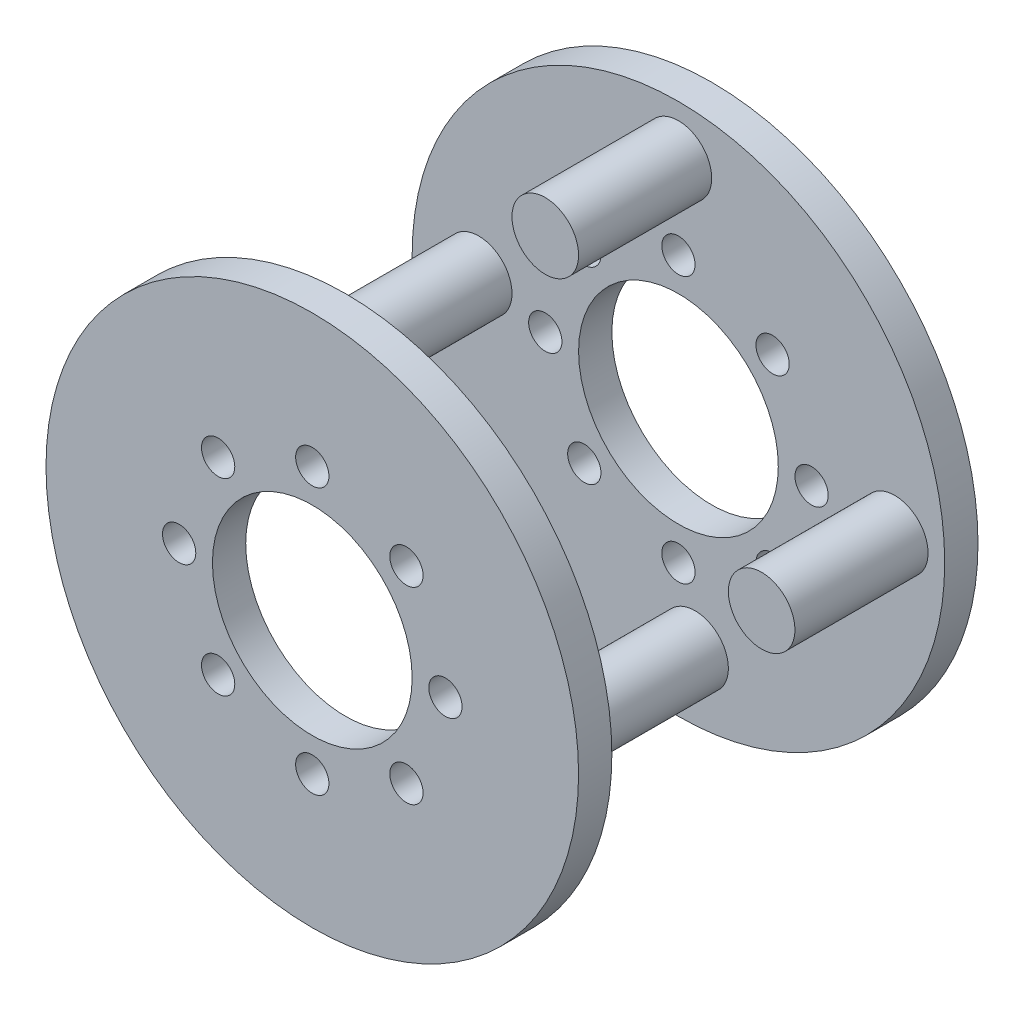
ISO-10303-21;
HEADER;
FILE_DESCRIPTION(('STEP AP214'),'2;1');
FILE_NAME('part.step','',(''),(''),'','','');
FILE_SCHEMA(('AUTOMOTIVE_DESIGN { 1 0 10303 214 1 1 1 1 }'));
ENDSEC;
DATA;
#1=APPLICATION_CONTEXT('core data for automotive mechanical design processes');
#2=APPLICATION_PROTOCOL_DEFINITION('international standard','automotive_design',2000,#1);
#3=PRODUCT_CONTEXT('',#1,'mechanical');
#4=PRODUCT('Part','Part','',(#3));
#5=PRODUCT_RELATED_PRODUCT_CATEGORY('part','',(#4));
#6=PRODUCT_DEFINITION_FORMATION('','',#4);
#7=PRODUCT_DEFINITION_CONTEXT('part definition',#1,'design');
#8=PRODUCT_DEFINITION('design','',#6,#7);
#9=PRODUCT_DEFINITION_SHAPE('','',#8);
#10=(LENGTH_UNIT() NAMED_UNIT(*) SI_UNIT(.MILLI.,.METRE.));
#11=(NAMED_UNIT(*) PLANE_ANGLE_UNIT() SI_UNIT($,.RADIAN.));
#12=(NAMED_UNIT(*) SI_UNIT($,.STERADIAN.) SOLID_ANGLE_UNIT());
#13=UNCERTAINTY_MEASURE_WITH_UNIT(LENGTH_MEASURE(1.E-05),#10,'distance_accuracy_value','');
#14=(GEOMETRIC_REPRESENTATION_CONTEXT(3) GLOBAL_UNCERTAINTY_ASSIGNED_CONTEXT((#13)) GLOBAL_UNIT_ASSIGNED_CONTEXT((#10,
#11,#12)) REPRESENTATION_CONTEXT('',''));
#15=CARTESIAN_POINT('',(0.,0.,0.));
#16=DIRECTION('',(0.,0.,1.));
#17=DIRECTION('',(1.,0.,0.));
#18=AXIS2_PLACEMENT_3D('',#15,#16,#17);
#19=CARTESIAN_POINT('',(-2.79318507107451E-13,0.,60.));
#20=DIRECTION('',(0.,0.,-1.));
#21=DIRECTION('',(1.,0.,0.));
#22=AXIS2_PLACEMENT_3D('',#19,#20,#21);
#23=CYLINDRICAL_SURFACE('',#22,80.);
#24=CARTESIAN_POINT('',(-2.79318507107451E-13,0.,60.));
#25=DIRECTION('',(0.,0.,-1.));
#26=DIRECTION('',(-1.,0.,0.));
#27=AXIS2_PLACEMENT_3D('',#24,#25,#26);
#28=CIRCLE('',#27,80.);
#29=CARTESIAN_POINT('',(-80.0000000000003,0.,59.9999999999994));
#30=VERTEX_POINT('',#29);
#31=EDGE_CURVE('E68',#30,#30,#28,.T.);
#32=ORIENTED_EDGE('',*,*,#31,.T.);
#33=EDGE_LOOP('',(#32));
#34=FACE_BOUND('',#33,.T.);
#35=CARTESIAN_POINT('',(-2.09488880330588E-13,0.,50.));
#36=DIRECTION('',(0.,0.,-1.));
#37=DIRECTION('',(-1.,0.,0.));
#38=AXIS2_PLACEMENT_3D('',#35,#36,#37);
#39=CIRCLE('',#38,80.);
#40=CARTESIAN_POINT('',(-80.0000000000002,0.,49.9999999999994));
#41=VERTEX_POINT('',#40);
#42=EDGE_CURVE('E69',#41,#41,#39,.T.);
#43=ORIENTED_EDGE('',*,*,#42,.F.);
#44=EDGE_LOOP('',(#43));
#45=FACE_BOUND('',#44,.T.);
#46=ADVANCED_FACE('F45',(#34,#45),#23,.T.);
#47=CARTESIAN_POINT('',(-2.79318507107451E-13,0.,60.));
#48=DIRECTION('',(0.,0.,1.));
#49=DIRECTION('',(-1.,0.,0.));
#50=AXIS2_PLACEMENT_3D('',#47,#48,#49);
#51=PLANE('',#50);
#52=CARTESIAN_POINT('',(39.9999999999996,-4.18977760661176E-13,60.0000000000003));
#53=DIRECTION('',(0.,0.,1.));
#54=DIRECTION('',(0.,-1.,0.));
#55=AXIS2_PLACEMENT_3D('',#52,#53,#54);
#56=CIRCLE('',#55,5.);
#57=CARTESIAN_POINT('',(39.9999999999996,-5.00000000000042,60.0000000000002));
#58=VERTEX_POINT('',#57);
#59=EDGE_CURVE('E97',#58,#58,#56,.T.);
#60=ORIENTED_EDGE('',*,*,#59,.F.);
#61=EDGE_LOOP('',(#60));
#62=FACE_BOUND('',#61,.T.);
#63=CARTESIAN_POINT('',(28.2842712474611,-28.2842712474622,60.0000000000002));
#64=DIRECTION('',(0.,0.,1.));
#65=DIRECTION('',(-0.707106781186551,-0.707106781186544,0.));
#66=AXIS2_PLACEMENT_3D('',#63,#64,#65);
#67=CIRCLE('',#66,5.);
#68=CARTESIAN_POINT('',(24.7487373415284,-31.819805153395,60.0000000000001));
#69=VERTEX_POINT('',#68);
#70=EDGE_CURVE('E122',#69,#69,#67,.T.);
#71=ORIENTED_EDGE('',*,*,#70,.F.);
#72=EDGE_LOOP('',(#71));
#73=FACE_BOUND('',#72,.T.);
#74=CARTESIAN_POINT('',(-6.98296267768627E-13,-40.,60.));
#75=DIRECTION('',(0.,0.,1.));
#76=DIRECTION('',(-1.,0.,0.));
#77=AXIS2_PLACEMENT_3D('',#74,#75,#76);
#78=CIRCLE('',#77,5.);
#79=CARTESIAN_POINT('',(-5.0000000000007,-40.,59.9999999999999));
#80=VERTEX_POINT('',#79);
#81=EDGE_CURVE('E114',#80,#80,#78,.T.);
#82=ORIENTED_EDGE('',*,*,#81,.F.);
#83=EDGE_LOOP('',(#82));
#84=FACE_BOUND('',#83,.T.);
#85=CARTESIAN_POINT('',(-28.2842712474628,-28.2842712474615,59.9999999999998));
#86=DIRECTION('',(0.,0.,1.));
#87=DIRECTION('',(-0.707106781186541,0.707106781186554,0.));
#88=AXIS2_PLACEMENT_3D('',#85,#86,#87);
#89=CIRCLE('',#88,5.);
#90=CARTESIAN_POINT('',(-31.8198051533955,-24.7487373415287,59.9999999999998));
#91=VERTEX_POINT('',#90);
#92=EDGE_CURVE('E105',#91,#91,#89,.T.);
#93=ORIENTED_EDGE('',*,*,#92,.F.);
#94=EDGE_LOOP('',(#93));
#95=FACE_BOUND('',#94,.T.);
#96=CARTESIAN_POINT('',(-40.0000000000004,6.98296267768627E-13,59.9999999999997));
#97=DIRECTION('',(0.,0.,1.));
#98=DIRECTION('',(0.,1.,0.));
#99=AXIS2_PLACEMENT_3D('',#96,#97,#98);
#100=CIRCLE('',#99,5.);
#101=CARTESIAN_POINT('',(-40.0000000000004,5.0000000000007,59.9999999999997));
#102=VERTEX_POINT('',#101);
#103=EDGE_CURVE('E106',#102,#102,#100,.T.);
#104=ORIENTED_EDGE('',*,*,#103,.F.);
#105=EDGE_LOOP('',(#104));
#106=FACE_BOUND('',#105,.T.);
#107=CARTESIAN_POINT('',(-28.2842712474618,28.2842712474624,59.9999999999998));
#108=DIRECTION('',(0.,0.,1.));
#109=DIRECTION('',(0.707106781186556,0.707106781186539,0.));
#110=AXIS2_PLACEMENT_3D('',#107,#108,#109);
#111=CIRCLE('',#110,5.);
#112=CARTESIAN_POINT('',(-24.748737341529,31.8198051533951,59.9999999999998));
#113=VERTEX_POINT('',#112);
#114=EDGE_CURVE('E137',#113,#113,#111,.T.);
#115=ORIENTED_EDGE('',*,*,#114,.F.);
#116=EDGE_LOOP('',(#115));
#117=FACE_BOUND('',#116,.T.);
#118=CARTESIAN_POINT('',(28.2842712474617,28.2842712474617,60.0000000000002));
#119=DIRECTION('',(0.,0.,1.));
#120=DIRECTION('',(0.707106781186546,-0.707106781186549,0.));
#121=AXIS2_PLACEMENT_3D('',#118,#119,#120);
#122=CIRCLE('',#121,5.);
#123=CARTESIAN_POINT('',(31.8198051533945,24.7487373415289,60.0000000000002));
#124=VERTEX_POINT('',#123);
#125=EDGE_CURVE('E89',#124,#124,#122,.T.);
#126=ORIENTED_EDGE('',*,*,#125,.F.);
#127=EDGE_LOOP('',(#126));
#128=FACE_BOUND('',#127,.T.);
#129=CARTESIAN_POINT('',(-1.39659253553725E-13,40.,60.));
#130=DIRECTION('',(0.,0.,1.));
#131=DIRECTION('',(1.,0.,0.));
#132=AXIS2_PLACEMENT_3D('',#129,#130,#131);
#133=CIRCLE('',#132,5.);
#134=CARTESIAN_POINT('',(4.99999999999986,40.,60.));
#135=VERTEX_POINT('',#134);
#136=EDGE_CURVE('E81',#135,#135,#133,.T.);
#137=ORIENTED_EDGE('',*,*,#136,.F.);
#138=EDGE_LOOP('',(#137));
#139=FACE_BOUND('',#138,.T.);
#140=CARTESIAN_POINT('',(-1.39659253553725E-13,0.,60.));
#141=DIRECTION('',(0.,0.,1.));
#142=DIRECTION('',(1.,0.,0.));
#143=AXIS2_PLACEMENT_3D('',#140,#141,#142);
#144=CIRCLE('',#143,30.);
#145=CARTESIAN_POINT('',(29.9999999999999,0.,60.));
#146=VERTEX_POINT('',#145);
#147=EDGE_CURVE('E73',#146,#146,#144,.T.);
#148=ORIENTED_EDGE('',*,*,#147,.F.);
#149=EDGE_LOOP('',(#148));
#150=FACE_BOUND('',#149,.T.);
#151=ORIENTED_EDGE('',*,*,#31,.F.);
#152=EDGE_LOOP('',(#151));
#153=FACE_BOUND('',#152,.T.);
#154=ADVANCED_FACE('F177',(#62,#73,#84,#95,#106,#117,#128,#139,#150,#153),#51,.T.);
#155=CARTESIAN_POINT('',(-2.09488880330588E-13,0.,50.));
#156=DIRECTION('',(0.,0.,1.));
#157=DIRECTION('',(-1.,0.,0.));
#158=AXIS2_PLACEMENT_3D('',#155,#156,#157);
#159=PLANE('',#158);
#160=CARTESIAN_POINT('',(-65.0000000000004,8.90306508011411E-13,49.9999999999996));
#161=DIRECTION('',(0.,0.,-1.));
#162=DIRECTION('',(-1.,0.,0.));
#163=AXIS2_PLACEMENT_3D('',#160,#161,#162);
#164=CIRCLE('',#163,10.);
#165=CARTESIAN_POINT('',(-75.0000000000003,8.90306508011411E-13,49.9999999999995));
#166=VERTEX_POINT('',#165);
#167=EDGE_CURVE('E11',#166,#166,#164,.F.);
#168=ORIENTED_EDGE('',*,*,#167,.T.);
#169=EDGE_LOOP('',(#168));
#170=FACE_BOUND('',#169,.T.);
#171=CARTESIAN_POINT('',(-5.58615780821314E-13,-65.,50.));
#172=DIRECTION('',(0.,0.,-1.));
#173=DIRECTION('',(-1.,0.,0.));
#174=AXIS2_PLACEMENT_3D('',#171,#172,#173);
#175=CIRCLE('',#174,10.);
#176=CARTESIAN_POINT('',(-10.0000000000006,-65.,49.9999999999999));
#177=VERTEX_POINT('',#176);
#178=EDGE_CURVE('E52',#177,#177,#175,.F.);
#179=ORIENTED_EDGE('',*,*,#178,.T.);
#180=EDGE_LOOP('',(#179));
#181=FACE_BOUND('',#180,.T.);
#182=CARTESIAN_POINT('',(64.9999999999997,-4.36413933961804E-13,50.0000000000005));
#183=DIRECTION('',(0.,0.,-1.));
#184=DIRECTION('',(-1.,0.,0.));
#185=AXIS2_PLACEMENT_3D('',#182,#183,#184);
#186=CIRCLE('',#185,10.);
#187=CARTESIAN_POINT('',(54.9999999999997,-4.36413933961804E-13,50.0000000000004));
#188=VERTEX_POINT('',#187);
#189=EDGE_CURVE('E57',#188,#188,#186,.F.);
#190=ORIENTED_EDGE('',*,*,#189,.T.);
#191=EDGE_LOOP('',(#190));
#192=FACE_BOUND('',#191,.T.);
#193=CARTESIAN_POINT('',(-1.39680486947313E-13,65.,50.));
#194=DIRECTION('',(0.,0.,-1.));
#195=DIRECTION('',(-1.,0.,0.));
#196=AXIS2_PLACEMENT_3D('',#193,#194,#195);
#197=CIRCLE('',#196,10.);
#198=CARTESIAN_POINT('',(-10.0000000000001,65.,49.9999999999999));
#199=VERTEX_POINT('',#198);
#200=EDGE_CURVE('E62',#199,#199,#197,.F.);
#201=ORIENTED_EDGE('',*,*,#200,.T.);
#202=EDGE_LOOP('',(#201));
#203=FACE_BOUND('',#202,.T.);
#204=CARTESIAN_POINT('',(39.9999999999997,-3.49148133884313E-13,50.0000000000003));
#205=DIRECTION('',(0.,0.,1.));
#206=DIRECTION('',(0.,-1.,0.));
#207=AXIS2_PLACEMENT_3D('',#204,#205,#206);
#208=CIRCLE('',#207,5.);
#209=CARTESIAN_POINT('',(39.9999999999996,-5.00000000000035,50.0000000000002));
#210=VERTEX_POINT('',#209);
#211=EDGE_CURVE('E126',#210,#210,#208,.T.);
#212=ORIENTED_EDGE('',*,*,#211,.T.);
#213=EDGE_LOOP('',(#212));
#214=FACE_BOUND('',#213,.T.);
#215=CARTESIAN_POINT('',(28.2842712474613,-28.2842712474622,50.0000000000002));
#216=DIRECTION('',(0.,0.,1.));
#217=DIRECTION('',(-0.707106781186551,-0.707106781186544,0.));
#218=AXIS2_PLACEMENT_3D('',#215,#216,#217);
#219=CIRCLE('',#218,5.);
#220=CARTESIAN_POINT('',(24.7487373415285,-31.8198051533949,50.0000000000001));
#221=VERTEX_POINT('',#220);
#222=EDGE_CURVE('E118',#221,#221,#219,.T.);
#223=ORIENTED_EDGE('',*,*,#222,.T.);
#224=EDGE_LOOP('',(#223));
#225=FACE_BOUND('',#224,.T.);
#226=CARTESIAN_POINT('',(-5.58637014214901E-13,-40.,50.));
#227=DIRECTION('',(0.,0.,1.));
#228=DIRECTION('',(-1.,0.,0.));
#229=AXIS2_PLACEMENT_3D('',#226,#227,#228);
#230=CIRCLE('',#229,5.);
#231=CARTESIAN_POINT('',(-5.00000000000056,-40.,49.9999999999999));
#232=VERTEX_POINT('',#231);
#233=EDGE_CURVE('E110',#232,#232,#230,.T.);
#234=ORIENTED_EDGE('',*,*,#233,.T.);
#235=EDGE_LOOP('',(#234));
#236=FACE_BOUND('',#235,.T.);
#237=CARTESIAN_POINT('',(-28.2842712474626,-28.2842712474615,49.9999999999998));
#238=DIRECTION('',(0.,0.,1.));
#239=DIRECTION('',(-0.707106781186541,0.707106781186554,0.));
#240=AXIS2_PLACEMENT_3D('',#237,#238,#239);
#241=CIRCLE('',#240,5.);
#242=CARTESIAN_POINT('',(-31.8198051533954,-24.7487373415287,49.9999999999997));
#243=VERTEX_POINT('',#242);
#244=EDGE_CURVE('E101',#243,#243,#241,.T.);
#245=ORIENTED_EDGE('',*,*,#244,.T.);
#246=EDGE_LOOP('',(#245));
#247=FACE_BOUND('',#246,.T.);
#248=CARTESIAN_POINT('',(-40.0000000000003,6.28466640991764E-13,49.9999999999997));
#249=DIRECTION('',(0.,0.,1.));
#250=DIRECTION('',(0.,1.,0.));
#251=AXIS2_PLACEMENT_3D('',#248,#249,#250);
#252=CIRCLE('',#251,5.);
#253=CARTESIAN_POINT('',(-40.0000000000003,5.00000000000063,49.9999999999997));
#254=VERTEX_POINT('',#253);
#255=EDGE_CURVE('E142',#254,#254,#252,.T.);
#256=ORIENTED_EDGE('',*,*,#255,.T.);
#257=EDGE_LOOP('',(#256));
#258=FACE_BOUND('',#257,.T.);
#259=CARTESIAN_POINT('',(-28.2842712474618,28.2842712474624,49.9999999999998));
#260=DIRECTION('',(0.,0.,1.));
#261=DIRECTION('',(0.707106781186556,0.707106781186539,0.));
#262=AXIS2_PLACEMENT_3D('',#259,#260,#261);
#263=CIRCLE('',#262,5.);
#264=CARTESIAN_POINT('',(-24.748737341529,31.8198051533951,49.9999999999998));
#265=VERTEX_POINT('',#264);
#266=EDGE_CURVE('E133',#265,#265,#263,.T.);
#267=ORIENTED_EDGE('',*,*,#266,.T.);
#268=EDGE_LOOP('',(#267));
#269=FACE_BOUND('',#268,.T.);
#270=CARTESIAN_POINT('',(28.2842712474618,28.2842712474617,50.0000000000002));
#271=DIRECTION('',(0.,0.,1.));
#272=DIRECTION('',(0.707106781186546,-0.707106781186549,0.));
#273=AXIS2_PLACEMENT_3D('',#270,#271,#272);
#274=CIRCLE('',#273,5.);
#275=CARTESIAN_POINT('',(31.8198051533945,24.748737341529,50.0000000000002));
#276=VERTEX_POINT('',#275);
#277=EDGE_CURVE('E93',#276,#276,#274,.T.);
#278=ORIENTED_EDGE('',*,*,#277,.T.);
#279=EDGE_LOOP('',(#278));
#280=FACE_BOUND('',#279,.T.);
#281=CARTESIAN_POINT('',(-1.39659253553725E-13,40.,50.));
#282=DIRECTION('',(0.,0.,1.));
#283=DIRECTION('',(1.,0.,0.));
#284=AXIS2_PLACEMENT_3D('',#281,#282,#283);
#285=CIRCLE('',#284,5.);
#286=CARTESIAN_POINT('',(4.99999999999986,40.,50.));
#287=VERTEX_POINT('',#286);
#288=EDGE_CURVE('E85',#287,#287,#285,.T.);
#289=ORIENTED_EDGE('',*,*,#288,.T.);
#290=EDGE_LOOP('',(#289));
#291=FACE_BOUND('',#290,.T.);
#292=CARTESIAN_POINT('',(-1.39659253553725E-13,0.,50.));
#293=DIRECTION('',(0.,0.,1.));
#294=DIRECTION('',(1.,0.,0.));
#295=AXIS2_PLACEMENT_3D('',#292,#293,#294);
#296=CIRCLE('',#295,30.);
#297=CARTESIAN_POINT('',(29.9999999999999,0.,50.));
#298=VERTEX_POINT('',#297);
#299=EDGE_CURVE('E77',#298,#298,#296,.T.);
#300=ORIENTED_EDGE('',*,*,#299,.T.);
#301=EDGE_LOOP('',(#300));
#302=FACE_BOUND('',#301,.T.);
#303=ORIENTED_EDGE('',*,*,#42,.T.);
#304=EDGE_LOOP('',(#303));
#305=FACE_BOUND('',#304,.T.);
#306=ADVANCED_FACE('F182',(#170,#181,#192,#203,#214,#225,#236,#247,#258,#269,#280,#291,#302,
#305),#159,.F.);
#307=CARTESIAN_POINT('',(-1.39659253553725E-13,0.,60.));
#308=DIRECTION('',(0.,0.,-1.));
#309=DIRECTION('',(1.,0.,0.));
#310=AXIS2_PLACEMENT_3D('',#307,#308,#309);
#311=CYLINDRICAL_SURFACE('',#310,30.);
#312=ORIENTED_EDGE('',*,*,#147,.T.);
#313=EDGE_LOOP('',(#312));
#314=FACE_BOUND('',#313,.T.);
#315=ORIENTED_EDGE('',*,*,#299,.F.);
#316=EDGE_LOOP('',(#315));
#317=FACE_BOUND('',#316,.T.);
#318=ADVANCED_FACE('F190',(#314,#317),#311,.F.);
#319=CARTESIAN_POINT('',(-1.39659253553725E-13,40.,60.));
#320=DIRECTION('',(0.,0.,-1.));
#321=DIRECTION('',(1.,0.,0.));
#322=AXIS2_PLACEMENT_3D('',#319,#320,#321);
#323=CYLINDRICAL_SURFACE('',#322,5.);
#324=ORIENTED_EDGE('',*,*,#136,.T.);
#325=EDGE_LOOP('',(#324));
#326=FACE_BOUND('',#325,.T.);
#327=ORIENTED_EDGE('',*,*,#288,.F.);
#328=EDGE_LOOP('',(#327));
#329=FACE_BOUND('',#328,.T.);
#330=ADVANCED_FACE('F194',(#326,#329),#323,.F.);
#331=CARTESIAN_POINT('',(28.2842712474617,28.2842712474617,60.0000000000002));
#332=DIRECTION('',(0.,0.,-1.));
#333=DIRECTION('',(0.,-1.,0.));
#334=AXIS2_PLACEMENT_3D('',#331,#332,#333);
#335=CYLINDRICAL_SURFACE('',#334,5.);
#336=ORIENTED_EDGE('',*,*,#125,.T.);
#337=EDGE_LOOP('',(#336));
#338=FACE_BOUND('',#337,.T.);
#339=ORIENTED_EDGE('',*,*,#277,.F.);
#340=EDGE_LOOP('',(#339));
#341=FACE_BOUND('',#340,.T.);
#342=ADVANCED_FACE('F200',(#338,#341),#335,.F.);
#343=CARTESIAN_POINT('',(-28.2842712474618,28.2842712474624,59.9999999999998));
#344=DIRECTION('',(0.,0.,-1.));
#345=DIRECTION('',(0.,-1.,0.));
#346=AXIS2_PLACEMENT_3D('',#343,#344,#345);
#347=CYLINDRICAL_SURFACE('',#346,5.);
#348=ORIENTED_EDGE('',*,*,#114,.T.);
#349=EDGE_LOOP('',(#348));
#350=FACE_BOUND('',#349,.T.);
#351=ORIENTED_EDGE('',*,*,#266,.F.);
#352=EDGE_LOOP('',(#351));
#353=FACE_BOUND('',#352,.T.);
#354=ADVANCED_FACE('F204',(#350,#353),#347,.F.);
#355=CARTESIAN_POINT('',(-40.0000000000004,6.98296267768627E-13,59.9999999999997));
#356=DIRECTION('',(0.,0.,-1.));
#357=DIRECTION('',(0.,-1.,0.));
#358=AXIS2_PLACEMENT_3D('',#355,#356,#357);
#359=CYLINDRICAL_SURFACE('',#358,5.);
#360=ORIENTED_EDGE('',*,*,#103,.T.);
#361=EDGE_LOOP('',(#360));
#362=FACE_BOUND('',#361,.T.);
#363=ORIENTED_EDGE('',*,*,#255,.F.);
#364=EDGE_LOOP('',(#363));
#365=FACE_BOUND('',#364,.T.);
#366=ADVANCED_FACE('F210',(#362,#365),#359,.F.);
#367=CARTESIAN_POINT('',(-28.2842712474628,-28.2842712474615,59.9999999999998));
#368=DIRECTION('',(0.,0.,-1.));
#369=DIRECTION('',(1.,0.,0.));
#370=AXIS2_PLACEMENT_3D('',#367,#368,#369);
#371=CYLINDRICAL_SURFACE('',#370,5.);
#372=ORIENTED_EDGE('',*,*,#92,.T.);
#373=EDGE_LOOP('',(#372));
#374=FACE_BOUND('',#373,.T.);
#375=ORIENTED_EDGE('',*,*,#244,.F.);
#376=EDGE_LOOP('',(#375));
#377=FACE_BOUND('',#376,.T.);
#378=ADVANCED_FACE('F206',(#374,#377),#371,.F.);
#379=CARTESIAN_POINT('',(-6.98296267768627E-13,-40.,60.));
#380=DIRECTION('',(0.,0.,-1.));
#381=DIRECTION('',(1.,0.,0.));
#382=AXIS2_PLACEMENT_3D('',#379,#380,#381);
#383=CYLINDRICAL_SURFACE('',#382,5.);
#384=ORIENTED_EDGE('',*,*,#81,.T.);
#385=EDGE_LOOP('',(#384));
#386=FACE_BOUND('',#385,.T.);
#387=ORIENTED_EDGE('',*,*,#233,.F.);
#388=EDGE_LOOP('',(#387));
#389=FACE_BOUND('',#388,.T.);
#390=ADVANCED_FACE('F209',(#386,#389),#383,.F.);
#391=CARTESIAN_POINT('',(28.2842712474611,-28.2842712474622,60.0000000000002));
#392=DIRECTION('',(0.,0.,-1.));
#393=DIRECTION('',(1.,0.,0.));
#394=AXIS2_PLACEMENT_3D('',#391,#392,#393);
#395=CYLINDRICAL_SURFACE('',#394,5.);
#396=ORIENTED_EDGE('',*,*,#70,.T.);
#397=EDGE_LOOP('',(#396));
#398=FACE_BOUND('',#397,.T.);
#399=ORIENTED_EDGE('',*,*,#222,.F.);
#400=EDGE_LOOP('',(#399));
#401=FACE_BOUND('',#400,.T.);
#402=ADVANCED_FACE('F214',(#398,#401),#395,.F.);
#403=CARTESIAN_POINT('',(39.9999999999996,-4.18977760661176E-13,60.0000000000003));
#404=DIRECTION('',(0.,0.,-1.));
#405=DIRECTION('',(1.,0.,0.));
#406=AXIS2_PLACEMENT_3D('',#403,#404,#405);
#407=CYLINDRICAL_SURFACE('',#406,5.);
#408=ORIENTED_EDGE('',*,*,#59,.T.);
#409=EDGE_LOOP('',(#408));
#410=FACE_BOUND('',#409,.T.);
#411=ORIENTED_EDGE('',*,*,#211,.F.);
#412=EDGE_LOOP('',(#411));
#413=FACE_BOUND('',#412,.T.);
#414=ADVANCED_FACE('F218',(#410,#413),#407,.F.);
#415=CARTESIAN_POINT('',(-1.39680486947313E-13,65.,10.));
#416=DIRECTION('',(0.,0.,1.));
#417=DIRECTION('',(-1.,0.,0.));
#418=AXIS2_PLACEMENT_3D('',#415,#416,#417);
#419=CYLINDRICAL_SURFACE('',#418,10.);
#420=CARTESIAN_POINT('',(-1.39680486947313E-13,65.,10.));
#421=DIRECTION('',(0.,0.,1.));
#422=DIRECTION('',(1.,0.,0.));
#423=AXIS2_PLACEMENT_3D('',#420,#421,#422);
#424=CIRCLE('',#423,10.);
#425=CARTESIAN_POINT('',(9.99999999999986,65.,10.));
#426=VERTEX_POINT('',#425);
#427=EDGE_CURVE('E138',#426,#426,#424,.T.);
#428=ORIENTED_EDGE('',*,*,#427,.T.);
#429=EDGE_LOOP('',(#428));
#430=FACE_BOUND('',#429,.T.);
#431=ORIENTED_EDGE('',*,*,#200,.F.);
#432=EDGE_LOOP('',(#431));
#433=FACE_BOUND('',#432,.T.);
#434=ADVANCED_FACE('F222',(#430,#433),#419,.T.);
#435=CARTESIAN_POINT('',(-1.39680486947313E-13,65.,10.));
#436=DIRECTION('',(0.,0.,-1.));
#437=DIRECTION('',(1.,0.,0.));
#438=AXIS2_PLACEMENT_3D('',#435,#436,#437);
#439=PLANE('',#438);
#440=ORIENTED_EDGE('',*,*,#427,.F.);
#441=EDGE_LOOP('',(#440));
#442=FACE_BOUND('',#441,.T.);
#443=ADVANCED_FACE('F232',(#442),#439,.T.);
#444=CARTESIAN_POINT('',(64.9999999999999,-1.57095426854353E-13,10.0000000000005));
#445=DIRECTION('',(0.,0.,1.));
#446=DIRECTION('',(-1.,0.,0.));
#447=AXIS2_PLACEMENT_3D('',#444,#445,#446);
#448=CYLINDRICAL_SURFACE('',#447,10.);
#449=CARTESIAN_POINT('',(64.9999999999999,-1.57095426854353E-13,10.0000000000005));
#450=DIRECTION('',(0.,0.,1.));
#451=DIRECTION('',(0.,-1.,0.));
#452=AXIS2_PLACEMENT_3D('',#449,#450,#451);
#453=CIRCLE('',#452,10.);
#454=CARTESIAN_POINT('',(64.9999999999999,-10.0000000000002,10.0000000000004));
#455=VERTEX_POINT('',#454);
#456=EDGE_CURVE('E152',#455,#455,#453,.T.);
#457=ORIENTED_EDGE('',*,*,#456,.T.);
#458=EDGE_LOOP('',(#457));
#459=FACE_BOUND('',#458,.T.);
#460=ORIENTED_EDGE('',*,*,#189,.F.);
#461=EDGE_LOOP('',(#460));
#462=FACE_BOUND('',#461,.T.);
#463=ADVANCED_FACE('F236',(#459,#462),#448,.T.);
#464=CARTESIAN_POINT('',(64.9999999999999,-1.57095426854353E-13,10.0000000000005));
#465=DIRECTION('',(0.,0.,-1.));
#466=DIRECTION('',(0.,-1.,0.));
#467=AXIS2_PLACEMENT_3D('',#464,#465,#466);
#468=PLANE('',#467);
#469=ORIENTED_EDGE('',*,*,#456,.F.);
#470=EDGE_LOOP('',(#469));
#471=FACE_BOUND('',#470,.T.);
#472=ADVANCED_FACE('F240',(#471),#468,.T.);
#473=CARTESIAN_POINT('',(0.,-65.,10.));
#474=DIRECTION('',(0.,0.,1.));
#475=DIRECTION('',(-1.,0.,0.));
#476=AXIS2_PLACEMENT_3D('',#473,#474,#475);
#477=CYLINDRICAL_SURFACE('',#476,10.);
#478=CARTESIAN_POINT('',(0.,-65.,10.));
#479=DIRECTION('',(0.,0.,1.));
#480=DIRECTION('',(-1.,0.,0.));
#481=AXIS2_PLACEMENT_3D('',#478,#479,#480);
#482=CIRCLE('',#481,10.);
#483=CARTESIAN_POINT('',(-10.,-65.,9.99999999999986));
#484=VERTEX_POINT('',#483);
#485=EDGE_CURVE('E156',#484,#484,#482,.T.);
#486=ORIENTED_EDGE('',*,*,#485,.T.);
#487=EDGE_LOOP('',(#486));
#488=FACE_BOUND('',#487,.T.);
#489=ORIENTED_EDGE('',*,*,#178,.F.);
#490=EDGE_LOOP('',(#489));
#491=FACE_BOUND('',#490,.T.);
#492=ADVANCED_FACE('F244',(#488,#491),#477,.T.);
#493=CARTESIAN_POINT('',(0.,-65.,10.));
#494=DIRECTION('',(0.,0.,-1.));
#495=DIRECTION('',(-1.,0.,0.));
#496=AXIS2_PLACEMENT_3D('',#493,#494,#495);
#497=PLANE('',#496);
#498=ORIENTED_EDGE('',*,*,#485,.F.);
#499=EDGE_LOOP('',(#498));
#500=FACE_BOUND('',#499,.T.);
#501=ADVANCED_FACE('F174',(#500),#497,.T.);
#502=CARTESIAN_POINT('',(-65.0000000000001,6.10988000903961E-13,9.99999999999955));
#503=DIRECTION('',(0.,0.,1.));
#504=DIRECTION('',(0.,1.,0.));
#505=AXIS2_PLACEMENT_3D('',#502,#503,#504);
#506=CYLINDRICAL_SURFACE('',#505,10.);
#507=CARTESIAN_POINT('',(-65.0000000000001,6.10988000903961E-13,9.99999999999955));
#508=DIRECTION('',(0.,0.,1.));
#509=DIRECTION('',(0.,1.,0.));
#510=AXIS2_PLACEMENT_3D('',#507,#508,#509);
#511=CIRCLE('',#510,10.);
#512=CARTESIAN_POINT('',(-65.,10.0000000000006,9.99999999999948));
#513=VERTEX_POINT('',#512);
#514=EDGE_CURVE('E160',#513,#513,#511,.T.);
#515=ORIENTED_EDGE('',*,*,#514,.T.);
#516=EDGE_LOOP('',(#515));
#517=FACE_BOUND('',#516,.T.);
#518=ORIENTED_EDGE('',*,*,#167,.F.);
#519=EDGE_LOOP('',(#518));
#520=FACE_BOUND('',#519,.T.);
#521=ADVANCED_FACE('F165',(#517,#520),#506,.T.);
#522=CARTESIAN_POINT('',(-65.0000000000001,6.10988000903961E-13,9.99999999999955));
#523=DIRECTION('',(0.,0.,-1.));
#524=DIRECTION('',(0.,1.,0.));
#525=AXIS2_PLACEMENT_3D('',#522,#523,#524);
#526=PLANE('',#525);
#527=ORIENTED_EDGE('',*,*,#514,.F.);
#528=EDGE_LOOP('',(#527));
#529=FACE_BOUND('',#528,.T.);
#530=ADVANCED_FACE('F168',(#529),#526,.T.);
#531=CLOSED_SHELL('',(#46,#154,#306,#318,#330,#342,#354,#366,#378,#390,#402,#414,#434,#443,#463,
#472,#492,#501,#521,#530));
#532=MANIFOLD_SOLID_BREP('B2',#531);
#533=CARTESIAN_POINT('',(-2.79318507107451E-13,0.,-60.));
#534=DIRECTION('',(0.,0.,1.));
#535=DIRECTION('',(1.,0.,0.));
#536=AXIS2_PLACEMENT_3D('',#533,#534,#535);
#537=CYLINDRICAL_SURFACE('',#536,80.);
#538=CARTESIAN_POINT('',(-2.79318507107451E-13,0.,-60.));
#539=DIRECTION('',(0.,0.,-1.));
#540=DIRECTION('',(-1.,0.,0.));
#541=AXIS2_PLACEMENT_3D('',#538,#539,#540);
#542=CIRCLE('',#541,80.);
#543=CARTESIAN_POINT('',(-80.0000000000003,0.,-59.9999999999994));
#544=VERTEX_POINT('',#543);
#545=EDGE_CURVE('E442',#544,#544,#542,.T.);
#546=ORIENTED_EDGE('',*,*,#545,.F.);
#547=EDGE_LOOP('',(#546));
#548=FACE_BOUND('',#547,.T.);
#549=CARTESIAN_POINT('',(-2.09488880330588E-13,0.,-50.));
#550=DIRECTION('',(0.,0.,-1.));
#551=DIRECTION('',(-1.,0.,0.));
#552=AXIS2_PLACEMENT_3D('',#549,#550,#551);
#553=CIRCLE('',#552,80.);
#554=CARTESIAN_POINT('',(-80.0000000000002,0.,-49.9999999999994));
#555=VERTEX_POINT('',#554);
#556=EDGE_CURVE('E443',#555,#555,#553,.T.);
#557=ORIENTED_EDGE('',*,*,#556,.T.);
#558=EDGE_LOOP('',(#557));
#559=FACE_BOUND('',#558,.T.);
#560=ADVANCED_FACE('F423',(#548,#559),#537,.T.);
#561=CARTESIAN_POINT('',(-2.79318507107451E-13,0.,-60.));
#562=DIRECTION('',(0.,0.,-1.));
#563=DIRECTION('',(-1.,0.,0.));
#564=AXIS2_PLACEMENT_3D('',#561,#562,#563);
#565=PLANE('',#564);
#566=CARTESIAN_POINT('',(39.9999999999996,-4.18977760661176E-13,-60.0000000000003));
#567=DIRECTION('',(0.,0.,1.));
#568=DIRECTION('',(0.,-1.,0.));
#569=AXIS2_PLACEMENT_3D('',#566,#567,#568);
#570=CIRCLE('',#569,5.);
#571=CARTESIAN_POINT('',(39.9999999999996,-5.00000000000042,-60.0000000000002));
#572=VERTEX_POINT('',#571);
#573=EDGE_CURVE('E464',#572,#572,#570,.T.);
#574=ORIENTED_EDGE('',*,*,#573,.T.);
#575=EDGE_LOOP('',(#574));
#576=FACE_BOUND('',#575,.T.);
#577=CARTESIAN_POINT('',(28.2842712474611,-28.2842712474622,-60.0000000000002));
#578=DIRECTION('',(0.,0.,1.));
#579=DIRECTION('',(-0.707106781186551,-0.707106781186544,0.));
#580=AXIS2_PLACEMENT_3D('',#577,#578,#579);
#581=CIRCLE('',#580,5.);
#582=CARTESIAN_POINT('',(24.7487373415284,-31.819805153395,-60.0000000000001));
#583=VERTEX_POINT('',#582);
#584=EDGE_CURVE('E483',#583,#583,#581,.T.);
#585=ORIENTED_EDGE('',*,*,#584,.T.);
#586=EDGE_LOOP('',(#585));
#587=FACE_BOUND('',#586,.T.);
#588=CARTESIAN_POINT('',(-6.98296267768627E-13,-40.,-60.));
#589=DIRECTION('',(0.,0.,1.));
#590=DIRECTION('',(-1.,0.,0.));
#591=AXIS2_PLACEMENT_3D('',#588,#589,#590);
#592=CIRCLE('',#591,5.);
#593=CARTESIAN_POINT('',(-5.0000000000007,-40.,-59.9999999999999));
#594=VERTEX_POINT('',#593);
#595=EDGE_CURVE('E477',#594,#594,#592,.T.);
#596=ORIENTED_EDGE('',*,*,#595,.T.);
#597=EDGE_LOOP('',(#596));
#598=FACE_BOUND('',#597,.T.);
#599=CARTESIAN_POINT('',(-28.2842712474628,-28.2842712474615,-59.9999999999998));
#600=DIRECTION('',(0.,0.,1.));
#601=DIRECTION('',(-0.707106781186541,0.707106781186554,0.));
#602=AXIS2_PLACEMENT_3D('',#599,#600,#601);
#603=CIRCLE('',#602,5.);
#604=CARTESIAN_POINT('',(-31.8198051533955,-24.7487373415287,-59.9999999999998));
#605=VERTEX_POINT('',#604);
#606=EDGE_CURVE('E470',#605,#605,#603,.T.);
#607=ORIENTED_EDGE('',*,*,#606,.T.);
#608=EDGE_LOOP('',(#607));
#609=FACE_BOUND('',#608,.T.);
#610=CARTESIAN_POINT('',(-40.0000000000004,6.98296267768627E-13,-59.9999999999997));
#611=DIRECTION('',(0.,0.,1.));
#612=DIRECTION('',(0.,1.,0.));
#613=AXIS2_PLACEMENT_3D('',#610,#611,#612);
#614=CIRCLE('',#613,5.);
#615=CARTESIAN_POINT('',(-40.0000000000004,5.0000000000007,-59.9999999999997));
#616=VERTEX_POINT('',#615);
#617=EDGE_CURVE('E471',#616,#616,#614,.T.);
#618=ORIENTED_EDGE('',*,*,#617,.T.);
#619=EDGE_LOOP('',(#618));
#620=FACE_BOUND('',#619,.T.);
#621=CARTESIAN_POINT('',(-28.2842712474618,28.2842712474624,-59.9999999999998));
#622=DIRECTION('',(0.,0.,1.));
#623=DIRECTION('',(0.707106781186556,0.707106781186539,0.));
#624=AXIS2_PLACEMENT_3D('',#621,#622,#623);
#625=CIRCLE('',#624,5.);
#626=CARTESIAN_POINT('',(-24.748737341529,31.8198051533951,-59.9999999999998));
#627=VERTEX_POINT('',#626);
#628=EDGE_CURVE('E494',#627,#627,#625,.T.);
#629=ORIENTED_EDGE('',*,*,#628,.T.);
#630=EDGE_LOOP('',(#629));
#631=FACE_BOUND('',#630,.T.);
#632=CARTESIAN_POINT('',(28.2842712474617,28.2842712474617,-60.0000000000002));
#633=DIRECTION('',(0.,0.,1.));
#634=DIRECTION('',(0.707106781186546,-0.707106781186549,0.));
#635=AXIS2_PLACEMENT_3D('',#632,#633,#634);
#636=CIRCLE('',#635,5.);
#637=CARTESIAN_POINT('',(31.8198051533945,24.7487373415289,-60.0000000000002));
#638=VERTEX_POINT('',#637);
#639=EDGE_CURVE('E458',#638,#638,#636,.T.);
#640=ORIENTED_EDGE('',*,*,#639,.T.);
#641=EDGE_LOOP('',(#640));
#642=FACE_BOUND('',#641,.T.);
#643=CARTESIAN_POINT('',(-1.39659253553725E-13,40.,-60.));
#644=DIRECTION('',(0.,0.,1.));
#645=DIRECTION('',(1.,0.,0.));
#646=AXIS2_PLACEMENT_3D('',#643,#644,#645);
#647=CIRCLE('',#646,5.);
#648=CARTESIAN_POINT('',(4.99999999999986,40.,-60.));
#649=VERTEX_POINT('',#648);
#650=EDGE_CURVE('E452',#649,#649,#647,.T.);
#651=ORIENTED_EDGE('',*,*,#650,.T.);
#652=EDGE_LOOP('',(#651));
#653=FACE_BOUND('',#652,.T.);
#654=CARTESIAN_POINT('',(-1.39659253553725E-13,0.,-60.));
#655=DIRECTION('',(0.,0.,1.));
#656=DIRECTION('',(1.,0.,0.));
#657=AXIS2_PLACEMENT_3D('',#654,#655,#656);
#658=CIRCLE('',#657,30.);
#659=CARTESIAN_POINT('',(29.9999999999999,0.,-60.));
#660=VERTEX_POINT('',#659);
#661=EDGE_CURVE('E446',#660,#660,#658,.T.);
#662=ORIENTED_EDGE('',*,*,#661,.T.);
#663=EDGE_LOOP('',(#662));
#664=FACE_BOUND('',#663,.T.);
#665=ORIENTED_EDGE('',*,*,#545,.T.);
#666=EDGE_LOOP('',(#665));
#667=FACE_BOUND('',#666,.T.);
#668=ADVANCED_FACE('F530',(#576,#587,#598,#609,#620,#631,#642,#653,#664,#667),#565,.T.);
#669=CARTESIAN_POINT('',(-2.09488880330588E-13,0.,-50.));
#670=DIRECTION('',(0.,0.,-1.));
#671=DIRECTION('',(-1.,0.,0.));
#672=AXIS2_PLACEMENT_3D('',#669,#670,#671);
#673=PLANE('',#672);
#674=CARTESIAN_POINT('',(-65.0000000000004,8.90306508011411E-13,-49.9999999999996));
#675=DIRECTION('',(0.,0.,-1.));
#676=DIRECTION('',(-1.,0.,0.));
#677=AXIS2_PLACEMENT_3D('',#674,#675,#676);
#678=CIRCLE('',#677,10.);
#679=CARTESIAN_POINT('',(-75.0000000000003,8.90306508011411E-13,-49.9999999999995));
#680=VERTEX_POINT('',#679);
#681=EDGE_CURVE('E44',#680,#680,#678,.F.);
#682=ORIENTED_EDGE('',*,*,#681,.F.);
#683=EDGE_LOOP('',(#682));
#684=FACE_BOUND('',#683,.T.);
#685=CARTESIAN_POINT('',(-5.58615780821314E-13,-65.,-50.));
#686=DIRECTION('',(0.,0.,-1.));
#687=DIRECTION('',(-1.,0.,0.));
#688=AXIS2_PLACEMENT_3D('',#685,#686,#687);
#689=CIRCLE('',#688,10.);
#690=CARTESIAN_POINT('',(-10.0000000000006,-65.,-49.9999999999999));
#691=VERTEX_POINT('',#690);
#692=EDGE_CURVE('E429',#691,#691,#689,.F.);
#693=ORIENTED_EDGE('',*,*,#692,.F.);
#694=EDGE_LOOP('',(#693));
#695=FACE_BOUND('',#694,.T.);
#696=CARTESIAN_POINT('',(64.9999999999997,-4.36413933961804E-13,-50.0000000000005));
#697=DIRECTION('',(0.,0.,-1.));
#698=DIRECTION('',(-1.,0.,0.));
#699=AXIS2_PLACEMENT_3D('',#696,#697,#698);
#700=CIRCLE('',#699,10.);
#701=CARTESIAN_POINT('',(54.9999999999997,-4.36413933961804E-13,-50.0000000000004));
#702=VERTEX_POINT('',#701);
#703=EDGE_CURVE('E433',#702,#702,#700,.F.);
#704=ORIENTED_EDGE('',*,*,#703,.F.);
#705=EDGE_LOOP('',(#704));
#706=FACE_BOUND('',#705,.T.);
#707=CARTESIAN_POINT('',(-1.39680486947313E-13,65.,-50.));
#708=DIRECTION('',(0.,0.,-1.));
#709=DIRECTION('',(-1.,0.,0.));
#710=AXIS2_PLACEMENT_3D('',#707,#708,#709);
#711=CIRCLE('',#710,10.);
#712=CARTESIAN_POINT('',(-10.0000000000001,65.,-49.9999999999999));
#713=VERTEX_POINT('',#712);
#714=EDGE_CURVE('E437',#713,#713,#711,.F.);
#715=ORIENTED_EDGE('',*,*,#714,.F.);
#716=EDGE_LOOP('',(#715));
#717=FACE_BOUND('',#716,.T.);
#718=CARTESIAN_POINT('',(39.9999999999997,-3.49148133884313E-13,-50.0000000000003));
#719=DIRECTION('',(0.,0.,1.));
#720=DIRECTION('',(0.,-1.,0.));
#721=AXIS2_PLACEMENT_3D('',#718,#719,#720);
#722=CIRCLE('',#721,5.);
#723=CARTESIAN_POINT('',(39.9999999999996,-5.00000000000035,-50.0000000000002));
#724=VERTEX_POINT('',#723);
#725=EDGE_CURVE('E486',#724,#724,#722,.T.);
#726=ORIENTED_EDGE('',*,*,#725,.F.);
#727=EDGE_LOOP('',(#726));
#728=FACE_BOUND('',#727,.T.);
#729=CARTESIAN_POINT('',(28.2842712474613,-28.2842712474622,-50.0000000000002));
#730=DIRECTION('',(0.,0.,1.));
#731=DIRECTION('',(-0.707106781186551,-0.707106781186544,0.));
#732=AXIS2_PLACEMENT_3D('',#729,#730,#731);
#733=CIRCLE('',#732,5.);
#734=CARTESIAN_POINT('',(24.7487373415285,-31.8198051533949,-50.0000000000001));
#735=VERTEX_POINT('',#734);
#736=EDGE_CURVE('E480',#735,#735,#733,.T.);
#737=ORIENTED_EDGE('',*,*,#736,.F.);
#738=EDGE_LOOP('',(#737));
#739=FACE_BOUND('',#738,.T.);
#740=CARTESIAN_POINT('',(-5.58637014214901E-13,-40.,-50.));
#741=DIRECTION('',(0.,0.,1.));
#742=DIRECTION('',(-1.,0.,0.));
#743=AXIS2_PLACEMENT_3D('',#740,#741,#742);
#744=CIRCLE('',#743,5.);
#745=CARTESIAN_POINT('',(-5.00000000000056,-40.,-49.9999999999999));
#746=VERTEX_POINT('',#745);
#747=EDGE_CURVE('E474',#746,#746,#744,.T.);
#748=ORIENTED_EDGE('',*,*,#747,.F.);
#749=EDGE_LOOP('',(#748));
#750=FACE_BOUND('',#749,.T.);
#751=CARTESIAN_POINT('',(-28.2842712474626,-28.2842712474615,-49.9999999999998));
#752=DIRECTION('',(0.,0.,1.));
#753=DIRECTION('',(-0.707106781186541,0.707106781186554,0.));
#754=AXIS2_PLACEMENT_3D('',#751,#752,#753);
#755=CIRCLE('',#754,5.);
#756=CARTESIAN_POINT('',(-31.8198051533954,-24.7487373415287,-49.9999999999997));
#757=VERTEX_POINT('',#756);
#758=EDGE_CURVE('E467',#757,#757,#755,.T.);
#759=ORIENTED_EDGE('',*,*,#758,.F.);
#760=EDGE_LOOP('',(#759));
#761=FACE_BOUND('',#760,.T.);
#762=CARTESIAN_POINT('',(-40.0000000000003,6.28466640991764E-13,-49.9999999999997));
#763=DIRECTION('',(0.,0.,1.));
#764=DIRECTION('',(0.,1.,0.));
#765=AXIS2_PLACEMENT_3D('',#762,#763,#764);
#766=CIRCLE('',#765,5.);
#767=CARTESIAN_POINT('',(-40.0000000000003,5.00000000000063,-49.9999999999997));
#768=VERTEX_POINT('',#767);
#769=EDGE_CURVE('E498',#768,#768,#766,.T.);
#770=ORIENTED_EDGE('',*,*,#769,.F.);
#771=EDGE_LOOP('',(#770));
#772=FACE_BOUND('',#771,.T.);
#773=CARTESIAN_POINT('',(-28.2842712474618,28.2842712474624,-49.9999999999998));
#774=DIRECTION('',(0.,0.,1.));
#775=DIRECTION('',(0.707106781186556,0.707106781186539,0.));
#776=AXIS2_PLACEMENT_3D('',#773,#774,#775);
#777=CIRCLE('',#776,5.);
#778=CARTESIAN_POINT('',(-24.748737341529,31.8198051533951,-49.9999999999998));
#779=VERTEX_POINT('',#778);
#780=EDGE_CURVE('E491',#779,#779,#777,.T.);
#781=ORIENTED_EDGE('',*,*,#780,.F.);
#782=EDGE_LOOP('',(#781));
#783=FACE_BOUND('',#782,.T.);
#784=CARTESIAN_POINT('',(28.2842712474618,28.2842712474617,-50.0000000000002));
#785=DIRECTION('',(0.,0.,1.));
#786=DIRECTION('',(0.707106781186546,-0.707106781186549,0.));
#787=AXIS2_PLACEMENT_3D('',#784,#785,#786);
#788=CIRCLE('',#787,5.);
#789=CARTESIAN_POINT('',(31.8198051533945,24.748737341529,-50.0000000000002));
#790=VERTEX_POINT('',#789);
#791=EDGE_CURVE('E461',#790,#790,#788,.T.);
#792=ORIENTED_EDGE('',*,*,#791,.F.);
#793=EDGE_LOOP('',(#792));
#794=FACE_BOUND('',#793,.T.);
#795=CARTESIAN_POINT('',(-1.39659253553725E-13,40.,-50.));
#796=DIRECTION('',(0.,0.,1.));
#797=DIRECTION('',(1.,0.,0.));
#798=AXIS2_PLACEMENT_3D('',#795,#796,#797);
#799=CIRCLE('',#798,5.);
#800=CARTESIAN_POINT('',(4.99999999999986,40.,-50.));
#801=VERTEX_POINT('',#800);
#802=EDGE_CURVE('E455',#801,#801,#799,.T.);
#803=ORIENTED_EDGE('',*,*,#802,.F.);
#804=EDGE_LOOP('',(#803));
#805=FACE_BOUND('',#804,.T.);
#806=CARTESIAN_POINT('',(-1.39659253553725E-13,0.,-50.));
#807=DIRECTION('',(0.,0.,1.));
#808=DIRECTION('',(1.,0.,0.));
#809=AXIS2_PLACEMENT_3D('',#806,#807,#808);
#810=CIRCLE('',#809,30.);
#811=CARTESIAN_POINT('',(29.9999999999999,0.,-50.));
#812=VERTEX_POINT('',#811);
#813=EDGE_CURVE('E449',#812,#812,#810,.T.);
#814=ORIENTED_EDGE('',*,*,#813,.F.);
#815=EDGE_LOOP('',(#814));
#816=FACE_BOUND('',#815,.T.);
#817=ORIENTED_EDGE('',*,*,#556,.F.);
#818=EDGE_LOOP('',(#817));
#819=FACE_BOUND('',#818,.T.);
#820=ADVANCED_FACE('F535',(#684,#695,#706,#717,#728,#739,#750,#761,#772,#783,#794,#805,#816,
#819),#673,.F.);
#821=CARTESIAN_POINT('',(-1.39659253553725E-13,0.,-60.));
#822=DIRECTION('',(0.,0.,1.));
#823=DIRECTION('',(1.,0.,0.));
#824=AXIS2_PLACEMENT_3D('',#821,#822,#823);
#825=CYLINDRICAL_SURFACE('',#824,30.);
#826=ORIENTED_EDGE('',*,*,#661,.F.);
#827=EDGE_LOOP('',(#826));
#828=FACE_BOUND('',#827,.T.);
#829=ORIENTED_EDGE('',*,*,#813,.T.);
#830=EDGE_LOOP('',(#829));
#831=FACE_BOUND('',#830,.T.);
#832=ADVANCED_FACE('F543',(#828,#831),#825,.F.);
#833=CARTESIAN_POINT('',(-1.39659253553725E-13,40.,-60.));
#834=DIRECTION('',(0.,0.,1.));
#835=DIRECTION('',(1.,0.,0.));
#836=AXIS2_PLACEMENT_3D('',#833,#834,#835);
#837=CYLINDRICAL_SURFACE('',#836,5.);
#838=ORIENTED_EDGE('',*,*,#650,.F.);
#839=EDGE_LOOP('',(#838));
#840=FACE_BOUND('',#839,.T.);
#841=ORIENTED_EDGE('',*,*,#802,.T.);
#842=EDGE_LOOP('',(#841));
#843=FACE_BOUND('',#842,.T.);
#844=ADVANCED_FACE('F548',(#840,#843),#837,.F.);
#845=CARTESIAN_POINT('',(28.2842712474617,28.2842712474617,-60.0000000000002));
#846=DIRECTION('',(0.,0.,1.));
#847=DIRECTION('',(0.,-1.,0.));
#848=AXIS2_PLACEMENT_3D('',#845,#846,#847);
#849=CYLINDRICAL_SURFACE('',#848,5.);
#850=ORIENTED_EDGE('',*,*,#639,.F.);
#851=EDGE_LOOP('',(#850));
#852=FACE_BOUND('',#851,.T.);
#853=ORIENTED_EDGE('',*,*,#791,.T.);
#854=EDGE_LOOP('',(#853));
#855=FACE_BOUND('',#854,.T.);
#856=ADVANCED_FACE('F555',(#852,#855),#849,.F.);
#857=CARTESIAN_POINT('',(-28.2842712474618,28.2842712474624,-59.9999999999998));
#858=DIRECTION('',(0.,0.,1.));
#859=DIRECTION('',(0.,-1.,0.));
#860=AXIS2_PLACEMENT_3D('',#857,#858,#859);
#861=CYLINDRICAL_SURFACE('',#860,5.);
#862=ORIENTED_EDGE('',*,*,#628,.F.);
#863=EDGE_LOOP('',(#862));
#864=FACE_BOUND('',#863,.T.);
#865=ORIENTED_EDGE('',*,*,#780,.T.);
#866=EDGE_LOOP('',(#865));
#867=FACE_BOUND('',#866,.T.);
#868=ADVANCED_FACE('F559',(#864,#867),#861,.F.);
#869=CARTESIAN_POINT('',(-40.0000000000004,6.98296267768627E-13,-59.9999999999997));
#870=DIRECTION('',(0.,0.,1.));
#871=DIRECTION('',(0.,-1.,0.));
#872=AXIS2_PLACEMENT_3D('',#869,#870,#871);
#873=CYLINDRICAL_SURFACE('',#872,5.);
#874=ORIENTED_EDGE('',*,*,#617,.F.);
#875=EDGE_LOOP('',(#874));
#876=FACE_BOUND('',#875,.T.);
#877=ORIENTED_EDGE('',*,*,#769,.T.);
#878=EDGE_LOOP('',(#877));
#879=FACE_BOUND('',#878,.T.);
#880=ADVANCED_FACE('F565',(#876,#879),#873,.F.);
#881=CARTESIAN_POINT('',(-28.2842712474628,-28.2842712474615,-59.9999999999998));
#882=DIRECTION('',(0.,0.,1.));
#883=DIRECTION('',(1.,0.,0.));
#884=AXIS2_PLACEMENT_3D('',#881,#882,#883);
#885=CYLINDRICAL_SURFACE('',#884,5.);
#886=ORIENTED_EDGE('',*,*,#606,.F.);
#887=EDGE_LOOP('',(#886));
#888=FACE_BOUND('',#887,.T.);
#889=ORIENTED_EDGE('',*,*,#758,.T.);
#890=EDGE_LOOP('',(#889));
#891=FACE_BOUND('',#890,.T.);
#892=ADVANCED_FACE('F561',(#888,#891),#885,.F.);
#893=CARTESIAN_POINT('',(-6.98296267768627E-13,-40.,-60.));
#894=DIRECTION('',(0.,0.,1.));
#895=DIRECTION('',(1.,0.,0.));
#896=AXIS2_PLACEMENT_3D('',#893,#894,#895);
#897=CYLINDRICAL_SURFACE('',#896,5.);
#898=ORIENTED_EDGE('',*,*,#595,.F.);
#899=EDGE_LOOP('',(#898));
#900=FACE_BOUND('',#899,.T.);
#901=ORIENTED_EDGE('',*,*,#747,.T.);
#902=EDGE_LOOP('',(#901));
#903=FACE_BOUND('',#902,.T.);
#904=ADVANCED_FACE('F564',(#900,#903),#897,.F.);
#905=CARTESIAN_POINT('',(28.2842712474611,-28.2842712474622,-60.0000000000002));
#906=DIRECTION('',(0.,0.,1.));
#907=DIRECTION('',(1.,0.,0.));
#908=AXIS2_PLACEMENT_3D('',#905,#906,#907);
#909=CYLINDRICAL_SURFACE('',#908,5.);
#910=ORIENTED_EDGE('',*,*,#584,.F.);
#911=EDGE_LOOP('',(#910));
#912=FACE_BOUND('',#911,.T.);
#913=ORIENTED_EDGE('',*,*,#736,.T.);
#914=EDGE_LOOP('',(#913));
#915=FACE_BOUND('',#914,.T.);
#916=ADVANCED_FACE('F569',(#912,#915),#909,.F.);
#917=CARTESIAN_POINT('',(39.9999999999996,-4.18977760661176E-13,-60.0000000000003));
#918=DIRECTION('',(0.,0.,1.));
#919=DIRECTION('',(1.,0.,0.));
#920=AXIS2_PLACEMENT_3D('',#917,#918,#919);
#921=CYLINDRICAL_SURFACE('',#920,5.);
#922=ORIENTED_EDGE('',*,*,#573,.F.);
#923=EDGE_LOOP('',(#922));
#924=FACE_BOUND('',#923,.T.);
#925=ORIENTED_EDGE('',*,*,#725,.T.);
#926=EDGE_LOOP('',(#925));
#927=FACE_BOUND('',#926,.T.);
#928=ADVANCED_FACE('F573',(#924,#927),#921,.F.);
#929=CARTESIAN_POINT('',(-1.39680486947313E-13,65.,-10.));
#930=DIRECTION('',(0.,0.,-1.));
#931=DIRECTION('',(-1.,0.,0.));
#932=AXIS2_PLACEMENT_3D('',#929,#930,#931);
#933=CYLINDRICAL_SURFACE('',#932,10.);
#934=CARTESIAN_POINT('',(-1.39680486947313E-13,65.,-10.));
#935=DIRECTION('',(0.,0.,1.));
#936=DIRECTION('',(1.,0.,0.));
#937=AXIS2_PLACEMENT_3D('',#934,#935,#936);
#938=CIRCLE('',#937,10.);
#939=CARTESIAN_POINT('',(9.99999999999986,65.,-10.));
#940=VERTEX_POINT('',#939);
#941=EDGE_CURVE('E495',#940,#940,#938,.T.);
#942=ORIENTED_EDGE('',*,*,#941,.F.);
#943=EDGE_LOOP('',(#942));
#944=FACE_BOUND('',#943,.T.);
#945=ORIENTED_EDGE('',*,*,#714,.T.);
#946=EDGE_LOOP('',(#945));
#947=FACE_BOUND('',#946,.T.);
#948=ADVANCED_FACE('F577',(#944,#947),#933,.T.);
#949=CARTESIAN_POINT('',(-1.39680486947313E-13,65.,-10.));
#950=DIRECTION('',(0.,0.,1.));
#951=DIRECTION('',(1.,0.,0.));
#952=AXIS2_PLACEMENT_3D('',#949,#950,#951);
#953=PLANE('',#952);
#954=ORIENTED_EDGE('',*,*,#941,.T.);
#955=EDGE_LOOP('',(#954));
#956=FACE_BOUND('',#955,.T.);
#957=ADVANCED_FACE('F587',(#956),#953,.T.);
#958=CARTESIAN_POINT('',(64.9999999999999,-1.57095426854353E-13,-10.0000000000005));
#959=DIRECTION('',(0.,0.,-1.));
#960=DIRECTION('',(-1.,0.,0.));
#961=AXIS2_PLACEMENT_3D('',#958,#959,#960);
#962=CYLINDRICAL_SURFACE('',#961,10.);
#963=CARTESIAN_POINT('',(64.9999999999999,-1.57095426854353E-13,-10.0000000000005));
#964=DIRECTION('',(0.,0.,1.));
#965=DIRECTION('',(0.,-1.,0.));
#966=AXIS2_PLACEMENT_3D('',#963,#964,#965);
#967=CIRCLE('',#966,10.);
#968=CARTESIAN_POINT('',(64.9999999999999,-10.0000000000002,-10.0000000000004));
#969=VERTEX_POINT('',#968);
#970=EDGE_CURVE('E505',#969,#969,#967,.T.);
#971=ORIENTED_EDGE('',*,*,#970,.F.);
#972=EDGE_LOOP('',(#971));
#973=FACE_BOUND('',#972,.T.);
#974=ORIENTED_EDGE('',*,*,#703,.T.);
#975=EDGE_LOOP('',(#974));
#976=FACE_BOUND('',#975,.T.);
#977=ADVANCED_FACE('F591',(#973,#976),#962,.T.);
#978=CARTESIAN_POINT('',(64.9999999999999,-1.57095426854353E-13,-10.0000000000005));
#979=DIRECTION('',(0.,0.,1.));
#980=DIRECTION('',(0.,-1.,0.));
#981=AXIS2_PLACEMENT_3D('',#978,#979,#980);
#982=PLANE('',#981);
#983=ORIENTED_EDGE('',*,*,#970,.T.);
#984=EDGE_LOOP('',(#983));
#985=FACE_BOUND('',#984,.T.);
#986=ADVANCED_FACE('F595',(#985),#982,.T.);
#987=CARTESIAN_POINT('',(0.,-65.,-10.));
#988=DIRECTION('',(0.,0.,-1.));
#989=DIRECTION('',(-1.,0.,0.));
#990=AXIS2_PLACEMENT_3D('',#987,#988,#989);
#991=CYLINDRICAL_SURFACE('',#990,10.);
#992=CARTESIAN_POINT('',(0.,-65.,-10.));
#993=DIRECTION('',(0.,0.,1.));
#994=DIRECTION('',(-1.,0.,0.));
#995=AXIS2_PLACEMENT_3D('',#992,#993,#994);
#996=CIRCLE('',#995,10.);
#997=CARTESIAN_POINT('',(-10.,-65.,-9.99999999999986));
#998=VERTEX_POINT('',#997);
#999=EDGE_CURVE('E508',#998,#998,#996,.T.);
#1000=ORIENTED_EDGE('',*,*,#999,.F.);
#1001=EDGE_LOOP('',(#1000));
#1002=FACE_BOUND('',#1001,.T.);
#1003=ORIENTED_EDGE('',*,*,#692,.T.);
#1004=EDGE_LOOP('',(#1003));
#1005=FACE_BOUND('',#1004,.T.);
#1006=ADVANCED_FACE('F526',(#1002,#1005),#991,.T.);
#1007=CARTESIAN_POINT('',(0.,-65.,-10.));
#1008=DIRECTION('',(0.,0.,1.));
#1009=DIRECTION('',(-1.,0.,0.));
#1010=AXIS2_PLACEMENT_3D('',#1007,#1008,#1009);
#1011=PLANE('',#1010);
#1012=ORIENTED_EDGE('',*,*,#999,.T.);
#1013=EDGE_LOOP('',(#1012));
#1014=FACE_BOUND('',#1013,.T.);
#1015=ADVANCED_FACE('F519',(#1014),#1011,.T.);
#1016=CARTESIAN_POINT('',(-65.0000000000001,6.10988000903961E-13,-9.99999999999955));
#1017=DIRECTION('',(0.,0.,-1.));
#1018=DIRECTION('',(0.,1.,0.));
#1019=AXIS2_PLACEMENT_3D('',#1016,#1017,#1018);
#1020=CYLINDRICAL_SURFACE('',#1019,10.);
#1021=CARTESIAN_POINT('',(-65.0000000000001,6.10988000903961E-13,-9.99999999999955));
#1022=DIRECTION('',(0.,0.,1.));
#1023=DIRECTION('',(0.,1.,0.));
#1024=AXIS2_PLACEMENT_3D('',#1021,#1022,#1023);
#1025=CIRCLE('',#1024,10.);
#1026=CARTESIAN_POINT('',(-65.,10.0000000000006,-9.99999999999948));
#1027=VERTEX_POINT('',#1026);
#1028=EDGE_CURVE('E511',#1027,#1027,#1025,.T.);
#1029=ORIENTED_EDGE('',*,*,#1028,.F.);
#1030=EDGE_LOOP('',(#1029));
#1031=FACE_BOUND('',#1030,.T.);
#1032=ORIENTED_EDGE('',*,*,#681,.T.);
#1033=EDGE_LOOP('',(#1032));
#1034=FACE_BOUND('',#1033,.T.);
#1035=ADVANCED_FACE('F517',(#1031,#1034),#1020,.T.);
#1036=CARTESIAN_POINT('',(-65.0000000000001,6.10988000903961E-13,-9.99999999999955));
#1037=DIRECTION('',(0.,0.,1.));
#1038=DIRECTION('',(0.,1.,0.));
#1039=AXIS2_PLACEMENT_3D('',#1036,#1037,#1038);
#1040=PLANE('',#1039);
#1041=ORIENTED_EDGE('',*,*,#1028,.T.);
#1042=EDGE_LOOP('',(#1041));
#1043=FACE_BOUND('',#1042,.T.);
#1044=ADVANCED_FACE('F515',(#1043),#1040,.T.);
#1045=CLOSED_SHELL('',(#560,#668,#820,#832,#844,#856,#868,#880,#892,#904,#916,#928,#948,#957,
#977,#986,#1006,#1015,#1035,#1044));
#1046=MANIFOLD_SOLID_BREP('B6',#1045);
#1047=ADVANCED_BREP_SHAPE_REPRESENTATION('',(#18,#532,#1046),#14);
#1048=SHAPE_DEFINITION_REPRESENTATION(#9,#1047);
ENDSEC;
END-ISO-10303-21;
